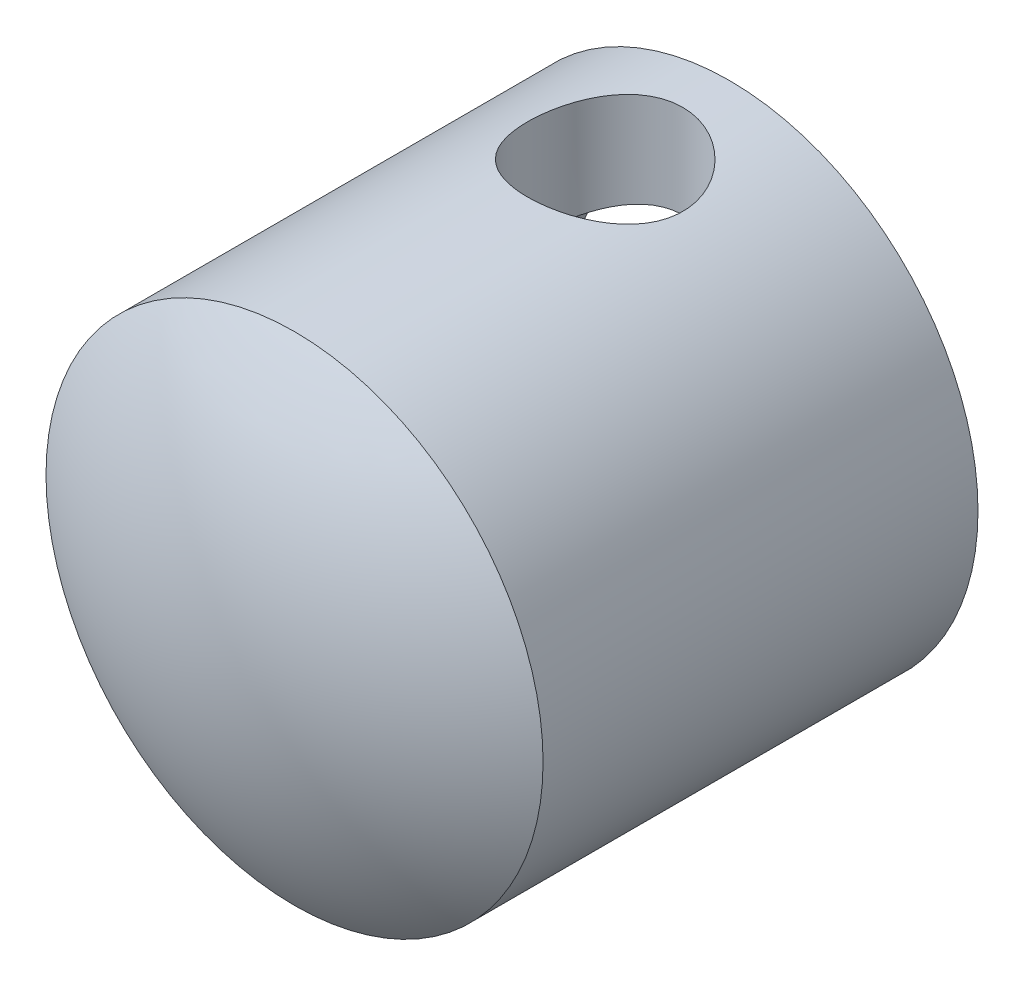
ISO-10303-21;
HEADER;
FILE_DESCRIPTION(('STEP AP214'),'2;1');
FILE_NAME('part.step','',(''),(''),'','','');
FILE_SCHEMA(('AUTOMOTIVE_DESIGN { 1 0 10303 214 1 1 1 1 }'));
ENDSEC;
DATA;
#1=APPLICATION_CONTEXT('core data for automotive mechanical design processes');
#2=APPLICATION_PROTOCOL_DEFINITION('international standard','automotive_design',2000,#1);
#3=PRODUCT_CONTEXT('',#1,'mechanical');
#4=PRODUCT('Part','Part','',(#3));
#5=PRODUCT_RELATED_PRODUCT_CATEGORY('part','',(#4));
#6=PRODUCT_DEFINITION_FORMATION('','',#4);
#7=PRODUCT_DEFINITION_CONTEXT('part definition',#1,'design');
#8=PRODUCT_DEFINITION('design','',#6,#7);
#9=PRODUCT_DEFINITION_SHAPE('','',#8);
#10=(LENGTH_UNIT() NAMED_UNIT(*) SI_UNIT(.MILLI.,.METRE.));
#11=(NAMED_UNIT(*) PLANE_ANGLE_UNIT() SI_UNIT($,.RADIAN.));
#12=(NAMED_UNIT(*) SI_UNIT($,.STERADIAN.) SOLID_ANGLE_UNIT());
#13=UNCERTAINTY_MEASURE_WITH_UNIT(LENGTH_MEASURE(1.E-05),#10,'distance_accuracy_value','');
#14=(GEOMETRIC_REPRESENTATION_CONTEXT(3) GLOBAL_UNCERTAINTY_ASSIGNED_CONTEXT((#13)) GLOBAL_UNIT_ASSIGNED_CONTEXT((#10,
#11,#12)) REPRESENTATION_CONTEXT('',''));
#15=CARTESIAN_POINT('',(0.,0.,0.));
#16=DIRECTION('',(0.,0.,1.));
#17=DIRECTION('',(1.,0.,0.));
#18=AXIS2_PLACEMENT_3D('',#15,#16,#17);
#19=CARTESIAN_POINT('',(0.,4.99999999999999,63.5));
#20=DIRECTION('',(0.,0.,-1.));
#21=DIRECTION('',(-1.,0.,0.));
#22=AXIS2_PLACEMENT_3D('',#19,#20,#21);
#23=PLANE('',#22);
#24=CARTESIAN_POINT('',(0.,0.,63.5));
#25=DIRECTION('',(0.,0.,-1.));
#26=DIRECTION('',(-1.,0.,0.));
#27=AXIS2_PLACEMENT_3D('',#24,#25,#26);
#28=CIRCLE('',#27,7.99999999999999);
#29=CARTESIAN_POINT('',(-7.99999999999999,0.,63.5));
#30=VERTEX_POINT('',#29);
#31=EDGE_CURVE('E11',#30,#30,#28,.T.);
#32=ORIENTED_EDGE('',*,*,#31,.T.);
#33=EDGE_LOOP('',(#32));
#34=FACE_BOUND('',#33,.T.);
#35=CARTESIAN_POINT('',(0.,0.,63.5));
#36=DIRECTION('',(0.,0.,-1.));
#37=DIRECTION('',(-1.,0.,0.));
#38=AXIS2_PLACEMENT_3D('',#35,#36,#37);
#39=CIRCLE('',#38,4.99999999999999);
#40=CARTESIAN_POINT('',(-4.99999999999999,0.,63.5));
#41=VERTEX_POINT('',#40);
#42=EDGE_CURVE('E72',#41,#41,#39,.T.);
#43=ORIENTED_EDGE('',*,*,#42,.F.);
#44=EDGE_LOOP('',(#43));
#45=FACE_BOUND('',#44,.T.);
#46=ADVANCED_FACE('F30',(#34,#45),#23,.T.);
#47=CARTESIAN_POINT('',(0.,0.,0.));
#48=DIRECTION('',(0.,0.,-1.));
#49=DIRECTION('',(-1.,0.,0.));
#50=AXIS2_PLACEMENT_3D('',#47,#48,#49);
#51=CYLINDRICAL_SURFACE('',#50,7.99999999999999);
#52=CARTESIAN_POINT('',(0.,-7.99999999999999,70.));
#53=CARTESIAN_POINT('',(-0.136878370349092,-7.99999931755979,69.9999991068248));
#54=CARTESIAN_POINT('',(-0.273766105005717,-7.99645389969681,69.9887215461111));
#55=CARTESIAN_POINT('',(-0.543538419176896,-7.98265788177612,69.9440275169215));
#56=CARTESIAN_POINT('',(-0.676422085451815,-7.97240576399718,69.9106060372713));
#57=CARTESIAN_POINT('',(-0.934257087301614,-7.94631631395818,69.8228612576086));
#58=CARTESIAN_POINT('',(-1.05922035397161,-7.93048762998049,69.7685703106941));
#59=CARTESIAN_POINT('',(-1.29826960469292,-7.89487938322184,69.6407653646433));
#60=CARTESIAN_POINT('',(-1.41235387088977,-7.87509919799809,69.5672483364388));
#61=CARTESIAN_POINT('',(-1.62993066990456,-7.83300427480564,69.4006880159653));
#62=CARTESIAN_POINT('',(-1.73304005631332,-7.81063431853977,69.3071582298779));
#63=CARTESIAN_POINT('',(-1.92239476407399,-7.76620092748416,69.1042632151729));
#64=CARTESIAN_POINT('',(-2.00863694579739,-7.74413755046914,68.9948950450109));
#65=CARTESIAN_POINT('',(-2.16388672966227,-7.70222289396344,68.7601108723838));
#66=CARTESIAN_POINT('',(-2.23241568300258,-7.6824397660359,68.6343650449456));
#67=CARTESIAN_POINT('',(-2.34719482153344,-7.64815603598468,68.3724153700363));
#68=CARTESIAN_POINT('',(-2.39345087543889,-7.63365404257376,68.2362142884121));
#69=CARTESIAN_POINT('',(-2.46096919860067,-7.61215213969001,67.9615438450959));
#70=CARTESIAN_POINT('',(-2.4829422001573,-7.60493945859016,67.8232663127223));
#71=CARTESIAN_POINT('',(-2.50349110073977,-7.598201102819,67.5448137621762));
#72=CARTESIAN_POINT('',(-2.50207321991544,-7.59867338454668,67.4046392583567));
#73=CARTESIAN_POINT('',(-2.47643649465479,-7.60706378150875,67.132251079462));
#74=CARTESIAN_POINT('',(-2.45312115738766,-7.61468683491896,66.9999417482769));
#75=CARTESIAN_POINT('',(-2.38581626711252,-7.63604051304977,66.7412156869253));
#76=CARTESIAN_POINT('',(-2.34182451689101,-7.64977178686229,66.6147995845824));
#77=CARTESIAN_POINT('',(-2.23377749362555,-7.68202088028592,66.3692961111347));
#78=CARTESIAN_POINT('',(-2.16943851324164,-7.70060569321648,66.250342778616));
#79=CARTESIAN_POINT('',(-2.02272041475696,-7.74043713160139,66.0246244642418));
#80=CARTESIAN_POINT('',(-1.94033661043155,-7.76168444789101,65.9178626594926));
#81=CARTESIAN_POINT('',(-1.75543390836425,-7.80563055600986,65.714450113166));
#82=CARTESIAN_POINT('',(-1.65216914118564,-7.8283513921139,65.6184808844406));
#83=CARTESIAN_POINT('',(-1.43072881619107,-7.8718314151916,65.4450562128407));
#84=CARTESIAN_POINT('',(-1.31255215469805,-7.89259045676744,65.3676021415616));
#85=CARTESIAN_POINT('',(-1.06332922093091,-7.93002589780382,65.2329446227974));
#86=CARTESIAN_POINT('',(-0.932189813838563,-7.94666921296415,65.1759037290721));
#87=CARTESIAN_POINT('',(-0.661535955565292,-7.97375911657107,65.0848939982969));
#88=CARTESIAN_POINT('',(-0.52202406144922,-7.98420758650304,65.0509181555232));
#89=CARTESIAN_POINT('',(-0.244370314580694,-7.99742778790026,65.008163914842));
#90=CARTESIAN_POINT('',(-0.10638369757769,-8.00048045790872,64.9984629128129));
#91=CARTESIAN_POINT('',(0.169260611465167,-7.99939599461966,65.0019324532746));
#92=CARTESIAN_POINT('',(0.306918348613013,-7.9952599116227,65.0150996546452));
#93=CARTESIAN_POINT('',(0.574438665951694,-7.98044727539522,65.0631911852128));
#94=CARTESIAN_POINT('',(0.704409956841871,-7.96993586221374,65.097566535225));
#95=CARTESIAN_POINT('',(0.956703857722752,-7.94360242758579,65.1864287047334));
#96=CARTESIAN_POINT('',(1.07902552089812,-7.92777975028687,65.24091800805));
#97=CARTESIAN_POINT('',(1.31586481334437,-7.89197085518847,65.3699464330974));
#98=CARTESIAN_POINT('',(1.43011947957558,-7.87189253635335,65.4449419749936));
#99=CARTESIAN_POINT('',(1.64473170192052,-7.82986820006858,65.6123064202348));
#100=CARTESIAN_POINT('',(1.7450854760879,-7.80792167695774,65.7046800354893));
#101=CARTESIAN_POINT('',(1.93317492583804,-7.76353989766282,65.9085177801042));
#102=CARTESIAN_POINT('',(2.02025304679063,-7.74111973412882,66.0205933274784));
#103=CARTESIAN_POINT('',(2.17442500490303,-7.69923894191211,66.2582532327535));
#104=CARTESIAN_POINT('',(2.24151915946859,-7.6797782662262,66.3838373760539));
#105=CARTESIAN_POINT('',(2.35340166961085,-7.64623564661737,66.6446903457409));
#106=CARTESIAN_POINT('',(2.39827639112025,-7.63213292713748,66.7799192988714));
#107=CARTESIAN_POINT('',(2.4644578863618,-7.6110234168862,67.0565449864972));
#108=CARTESIAN_POINT('',(2.48577362827989,-7.60401392602455,67.1979393526871));
#109=CARTESIAN_POINT('',(2.50358812316252,-7.59816585427752,67.4760081751608));
#110=CARTESIAN_POINT('',(2.50116559243272,-7.59897209200283,67.6126069076948));
#111=CARTESIAN_POINT('',(2.47417636257668,-7.60780180751806,67.8833491698839));
#112=CARTESIAN_POINT('',(2.44961069645025,-7.61582494863207,68.0174928137735));
#113=CARTESIAN_POINT('',(2.37975459827235,-7.63793628366779,68.2775880791838));
#114=CARTESIAN_POINT('',(2.33477284812017,-7.65193396380513,68.4036308821867));
#115=CARTESIAN_POINT('',(2.2256045467,-7.68439408509127,68.646480827068));
#116=CARTESIAN_POINT('',(2.16141408888474,-7.70285743429342,68.7632860841568));
#117=CARTESIAN_POINT('',(2.01271350026987,-7.74306974067005,68.9892919408796));
#118=CARTESIAN_POINT('',(1.92750667048265,-7.76491897845913,69.0980162590005));
#119=CARTESIAN_POINT('',(1.7404179928096,-7.80897997642419,69.299972656224));
#120=CARTESIAN_POINT('',(1.63853168468878,-7.83119183213308,69.3932005779821));
#121=CARTESIAN_POINT('',(1.4169733256467,-7.87434543904947,69.5645650767259));
#122=CARTESIAN_POINT('',(1.29682914897477,-7.89522203461345,69.6421094728999));
#123=CARTESIAN_POINT('',(1.04455827602731,-7.93253538593755,69.7757978302789));
#124=CARTESIAN_POINT('',(0.912436315590909,-7.94897388631643,69.8319502042837));
#125=CARTESIAN_POINT('',(0.651495270747968,-7.9744130146694,69.9171827352169));
#126=CARTESIAN_POINT('',(0.523340674225101,-7.98392481612282,69.9481497346107));
#127=CARTESIAN_POINT('',(0.263459790880499,-7.99671800680967,69.9895567199354));
#128=CARTESIAN_POINT('',(0.131734232279351,-8.00000065679285,70.000000859608));
#129=CARTESIAN_POINT('',(0.,-7.99999999999999,70.));
#130=B_SPLINE_CURVE_WITH_KNOTS('',3,(#52,#53,#54,#55,#56,#57,#58,#59,#60,#61,#62,#63,#64,#65,
#66,#67,#68,#69,#70,#71,#72,#73,#74,#75,#76,#77,#78,#79,#80,#81,#82,#83,#84,#85,#86,#87,#88,#89,
#90,#91,#92,#93,#94,#95,#96,#97,#98,#99,#100,#101,#102,#103,#104,#105,#106,#107,#108,#109,#110,
#111,#112,#113,#114,#115,#116,#117,#118,#119,#120,#121,#122,#123,#124,#125,#126,#127,#128,#129),
.UNSPECIFIED.,.T.,.F.,(4,2,2,2,2,2,2,2,2,2,2,2,2,2,2,2,2,2,2,2,2,2,2,2,2,2,2,2,2,2,2,2,2,2,2,2,
2,2,4),(0.,0.410150898865019,0.820394646698131,1.23000495840488,1.63967984311678,
2.06075644390316,2.48191134862553,2.91347542494989,3.34492572559054,3.76338300334422,
4.18172900590277,4.58353834844339,4.98539039958127,5.39311285441092,5.80094132020718,
6.22733494559201,6.65376014826607,7.08350921379542,7.51312768989109,7.92615137096476,
8.33911471298727,8.74181253445746,9.14456010069,9.55712649476688,9.9698049141852,
10.3988355742628,10.8278594196743,11.2552023150671,11.6823824779468,12.0902440696666,
12.4980866352127,12.8999582681244,13.3019116867945,13.7195902803182,14.1373807476578,
14.5688133627192,15.0000761335177,15.3948927332218,15.7896294154519),.UNSPECIFIED.);
#131=CARTESIAN_POINT('',(0.,-7.99999999999999,70.));
#132=VERTEX_POINT('',#131);
#133=EDGE_CURVE('E75',#132,#132,#130,.T.);
#134=ORIENTED_EDGE('',*,*,#133,.F.);
#135=EDGE_LOOP('',(#134));
#136=FACE_BOUND('',#135,.T.);
#137=CARTESIAN_POINT('',(0.,7.99999999999999,70.));
#138=CARTESIAN_POINT('',(0.136878370349093,7.99999931755979,69.9999991068248));
#139=CARTESIAN_POINT('',(0.273766105005718,7.99645389969681,69.9887215461111));
#140=CARTESIAN_POINT('',(0.543538419176896,7.98265788177612,69.9440275169215));
#141=CARTESIAN_POINT('',(0.676422085451816,7.97240576399718,69.9106060372713));
#142=CARTESIAN_POINT('',(0.934257087301615,7.94631631395818,69.8228612576086));
#143=CARTESIAN_POINT('',(1.05922035397161,7.93048762998049,69.7685703106941));
#144=CARTESIAN_POINT('',(1.29826960469292,7.89487938322184,69.6407653646433));
#145=CARTESIAN_POINT('',(1.41235387088977,7.87509919799809,69.5672483364388));
#146=CARTESIAN_POINT('',(1.62993066990456,7.83300427480564,69.4006880159653));
#147=CARTESIAN_POINT('',(1.73304005631332,7.81063431853977,69.3071582298779));
#148=CARTESIAN_POINT('',(1.92239476407399,7.76620092748416,69.1042632151729));
#149=CARTESIAN_POINT('',(2.00863694579739,7.74413755046914,68.9948950450109));
#150=CARTESIAN_POINT('',(2.16388672966227,7.70222289396344,68.7601108723838));
#151=CARTESIAN_POINT('',(2.23241568300258,7.6824397660359,68.6343650449456));
#152=CARTESIAN_POINT('',(2.34719482153344,7.64815603598468,68.3724153700363));
#153=CARTESIAN_POINT('',(2.3934508754389,7.63365404257376,68.2362142884121));
#154=CARTESIAN_POINT('',(2.46096919860067,7.61215213969001,67.9615438450959));
#155=CARTESIAN_POINT('',(2.4829422001573,7.60493945859016,67.8232663127223));
#156=CARTESIAN_POINT('',(2.50349110073977,7.598201102819,67.5448137621762));
#157=CARTESIAN_POINT('',(2.50207321991544,7.59867338454668,67.4046392583567));
#158=CARTESIAN_POINT('',(2.47643649465479,7.60706378150875,67.132251079462));
#159=CARTESIAN_POINT('',(2.45312115738766,7.61468683491896,66.9999417482769));
#160=CARTESIAN_POINT('',(2.38581626711252,7.63604051304977,66.7412156869253));
#161=CARTESIAN_POINT('',(2.34182451689101,7.64977178686229,66.6147995845824));
#162=CARTESIAN_POINT('',(2.23377749362555,7.68202088028592,66.3692961111347));
#163=CARTESIAN_POINT('',(2.16943851324164,7.70060569321648,66.250342778616));
#164=CARTESIAN_POINT('',(2.02272041475696,7.74043713160139,66.0246244642418));
#165=CARTESIAN_POINT('',(1.94033661043155,7.76168444789101,65.9178626594926));
#166=CARTESIAN_POINT('',(1.75543390836425,7.80563055600986,65.714450113166));
#167=CARTESIAN_POINT('',(1.65216914118564,7.8283513921139,65.6184808844406));
#168=CARTESIAN_POINT('',(1.43072881619107,7.8718314151916,65.4450562128407));
#169=CARTESIAN_POINT('',(1.31255215469805,7.89259045676744,65.3676021415616));
#170=CARTESIAN_POINT('',(1.06332922093091,7.93002589780382,65.2329446227974));
#171=CARTESIAN_POINT('',(0.932189813838564,7.94666921296415,65.1759037290721));
#172=CARTESIAN_POINT('',(0.661535955565292,7.97375911657107,65.0848939982969));
#173=CARTESIAN_POINT('',(0.522024061449221,7.98420758650304,65.0509181555232));
#174=CARTESIAN_POINT('',(0.244370314580695,7.99742778790026,65.008163914842));
#175=CARTESIAN_POINT('',(0.106383697577691,8.00048045790872,64.9984629128129));
#176=CARTESIAN_POINT('',(-0.169260611465166,7.99939599461966,65.0019324532746));
#177=CARTESIAN_POINT('',(-0.306918348613012,7.99525991162269,65.0150996546452));
#178=CARTESIAN_POINT('',(-0.574438665951693,7.98044727539522,65.0631911852128));
#179=CARTESIAN_POINT('',(-0.70440995684187,7.96993586221374,65.097566535225));
#180=CARTESIAN_POINT('',(-0.956703857722751,7.94360242758579,65.1864287047334));
#181=CARTESIAN_POINT('',(-1.07902552089811,7.92777975028687,65.24091800805));
#182=CARTESIAN_POINT('',(-1.31586481334437,7.89197085518847,65.3699464330974));
#183=CARTESIAN_POINT('',(-1.43011947957558,7.87189253635335,65.4449419749936));
#184=CARTESIAN_POINT('',(-1.64473170192052,7.82986820006859,65.6123064202348));
#185=CARTESIAN_POINT('',(-1.7450854760879,7.80792167695774,65.7046800354893));
#186=CARTESIAN_POINT('',(-1.93317492583804,7.76353989766282,65.9085177801042));
#187=CARTESIAN_POINT('',(-2.02025304679062,7.74111973412882,66.0205933274784));
#188=CARTESIAN_POINT('',(-2.17442500490303,7.69923894191211,66.2582532327535));
#189=CARTESIAN_POINT('',(-2.24151915946859,7.6797782662262,66.3838373760539));
#190=CARTESIAN_POINT('',(-2.35340166961085,7.64623564661737,66.6446903457409));
#191=CARTESIAN_POINT('',(-2.39827639112025,7.63213292713748,66.7799192988714));
#192=CARTESIAN_POINT('',(-2.4644578863618,7.6110234168862,67.0565449864972));
#193=CARTESIAN_POINT('',(-2.48577362827989,7.60401392602455,67.1979393526871));
#194=CARTESIAN_POINT('',(-2.50358812316252,7.59816585427752,67.4760081751609));
#195=CARTESIAN_POINT('',(-2.50116559243272,7.59897209200283,67.6126069076948));
#196=CARTESIAN_POINT('',(-2.47417636257668,7.60780180751806,67.8833491698839));
#197=CARTESIAN_POINT('',(-2.44961069645024,7.61582494863207,68.0174928137735));
#198=CARTESIAN_POINT('',(-2.37975459827235,7.63793628366779,68.2775880791838));
#199=CARTESIAN_POINT('',(-2.33477284812017,7.65193396380513,68.4036308821867));
#200=CARTESIAN_POINT('',(-2.2256045467,7.68439408509127,68.646480827068));
#201=CARTESIAN_POINT('',(-2.16141408888474,7.70285743429342,68.7632860841568));
#202=CARTESIAN_POINT('',(-2.01271350026988,7.74306974067004,68.9892919408796));
#203=CARTESIAN_POINT('',(-1.92750667048266,7.76491897845912,69.0980162590005));
#204=CARTESIAN_POINT('',(-1.74041799280961,7.80897997642419,69.299972656224));
#205=CARTESIAN_POINT('',(-1.63853168468879,7.83119183213308,69.3932005779821));
#206=CARTESIAN_POINT('',(-1.4169733256467,7.87434543904947,69.5645650767259));
#207=CARTESIAN_POINT('',(-1.29682914897477,7.89522203461345,69.6421094728999));
#208=CARTESIAN_POINT('',(-1.04455827602731,7.93253538593755,69.7757978302789));
#209=CARTESIAN_POINT('',(-0.912436315590908,7.94897388631643,69.8319502042837));
#210=CARTESIAN_POINT('',(-0.651495270747968,7.9744130146694,69.9171827352169));
#211=CARTESIAN_POINT('',(-0.5233406742251,7.98392481612282,69.9481497346107));
#212=CARTESIAN_POINT('',(-0.263459790880499,7.99671800680967,69.9895567199354));
#213=CARTESIAN_POINT('',(-0.131734232279351,8.00000065679285,70.000000859608));
#214=CARTESIAN_POINT('',(0.,7.99999999999999,70.));
#215=B_SPLINE_CURVE_WITH_KNOTS('',3,(#137,#138,#139,#140,#141,#142,#143,#144,#145,#146,#147,
#148,#149,#150,#151,#152,#153,#154,#155,#156,#157,#158,#159,#160,#161,#162,#163,#164,#165,#166,
#167,#168,#169,#170,#171,#172,#173,#174,#175,#176,#177,#178,#179,#180,#181,#182,#183,#184,#185,
#186,#187,#188,#189,#190,#191,#192,#193,#194,#195,#196,#197,#198,#199,#200,#201,#202,#203,#204,
#205,#206,#207,#208,#209,#210,#211,#212,#213,#214),.UNSPECIFIED.,.T.,.F.,(4,2,2,2,2,2,2,2,2,2,2,
2,2,2,2,2,2,2,2,2,2,2,2,2,2,2,2,2,2,2,2,2,2,2,2,2,2,2,4),(0.,0.410150898865019,
0.820394646698131,1.23000495840488,1.63967984311678,2.06075644390316,2.48191134862553,
2.91347542494989,3.34492572559054,3.76338300334422,4.18172900590277,4.58353834844339,
4.98539039958127,5.39311285441092,5.80094132020718,6.22733494559201,6.65376014826607,
7.08350921379542,7.51312768989109,7.92615137096476,8.33911471298727,8.74181253445746,
9.14456010069,9.55712649476687,9.96980491418519,10.3988355742628,10.8278594196743,
11.2552023150671,11.6823824779468,12.0902440696666,12.4980866352127,12.8999582681244,
13.3019116867944,13.7195902803182,14.1373807476578,14.5688133627192,15.0000761335177,
15.3948927332218,15.7896294154519),.UNSPECIFIED.);
#216=CARTESIAN_POINT('',(0.,7.99999999999999,70.));
#217=VERTEX_POINT('',#216);
#218=EDGE_CURVE('E81',#217,#217,#215,.T.);
#219=ORIENTED_EDGE('',*,*,#218,.F.);
#220=EDGE_LOOP('',(#219));
#221=FACE_BOUND('',#220,.T.);
#222=CARTESIAN_POINT('',(0.,0.,77.5));
#223=DIRECTION('',(0.,0.,-1.));
#224=DIRECTION('',(-1.,0.,0.));
#225=AXIS2_PLACEMENT_3D('',#222,#223,#224);
#226=CIRCLE('',#225,7.99999999999999);
#227=CARTESIAN_POINT('',(-7.99999999999999,0.,77.5));
#228=VERTEX_POINT('',#227);
#229=EDGE_CURVE('E41',#228,#228,#226,.T.);
#230=ORIENTED_EDGE('',*,*,#229,.T.);
#231=EDGE_LOOP('',(#230));
#232=FACE_BOUND('',#231,.T.);
#233=ORIENTED_EDGE('',*,*,#31,.F.);
#234=EDGE_LOOP('',(#233));
#235=FACE_BOUND('',#234,.T.);
#236=ADVANCED_FACE('F58',(#136,#221,#232,#235),#51,.T.);
#237=CARTESIAN_POINT('',(0.,0.,66.010874706924));
#238=DIRECTION('',(0.,0.,-1.));
#239=DIRECTION('',(0.,1.,0.));
#240=AXIS2_PLACEMENT_3D('',#237,#238,#239);
#241=SPHERICAL_SURFACE('',#240,14.);
#242=ORIENTED_EDGE('',*,*,#229,.F.);
#243=EDGE_LOOP('',(#242));
#244=FACE_BOUND('',#243,.T.);
#245=ADVANCED_FACE('F48',(#244),#241,.T.);
#246=CARTESIAN_POINT('',(0.,0.,77.4103988596214));
#247=DIRECTION('',(0.,0.,-1.));
#248=DIRECTION('',(-1.,0.,0.));
#249=AXIS2_PLACEMENT_3D('',#246,#247,#248);
#250=CONICAL_SURFACE('',#249,0.,0.941786206055793);
#251=CARTESIAN_POINT('',(0.,0.,74.5));
#252=DIRECTION('',(0.,0.,-1.));
#253=DIRECTION('',(-1.,0.,0.));
#254=AXIS2_PLACEMENT_3D('',#251,#252,#253);
#255=CIRCLE('',#254,4.00000000000001);
#256=CARTESIAN_POINT('',(-4.00000000000001,0.,74.5));
#257=VERTEX_POINT('',#256);
#258=EDGE_CURVE('E89',#257,#257,#255,.T.);
#259=ORIENTED_EDGE('',*,*,#258,.T.);
#260=EDGE_LOOP('',(#259));
#261=FACE_BOUND('',#260,.T.);
#262=CARTESIAN_POINT('',(0.,0.,77.4103988596214));
#263=VERTEX_POINT('',#262);
#264=VERTEX_LOOP('',#263);
#265=FACE_BOUND('',#264,.T.);
#266=ADVANCED_FACE('F45',(#261,#265),#250,.F.);
#267=CARTESIAN_POINT('',(0.,0.,0.));
#268=DIRECTION('',(0.,0.,-1.));
#269=DIRECTION('',(-1.,0.,0.));
#270=AXIS2_PLACEMENT_3D('',#267,#268,#269);
#271=CYLINDRICAL_SURFACE('',#270,4.00000000000001);
#272=CARTESIAN_POINT('',(0.,0.,73.5));
#273=DIRECTION('',(0.,0.,-1.));
#274=DIRECTION('',(-1.,0.,0.));
#275=AXIS2_PLACEMENT_3D('',#272,#273,#274);
#276=CIRCLE('',#275,4.00000000000001);
#277=CARTESIAN_POINT('',(-4.00000000000001,0.,73.5));
#278=VERTEX_POINT('',#277);
#279=EDGE_CURVE('E78',#278,#278,#276,.T.);
#280=ORIENTED_EDGE('',*,*,#279,.T.);
#281=EDGE_LOOP('',(#280));
#282=FACE_BOUND('',#281,.T.);
#283=ORIENTED_EDGE('',*,*,#258,.F.);
#284=EDGE_LOOP('',(#283));
#285=FACE_BOUND('',#284,.T.);
#286=ADVANCED_FACE('F47',(#282,#285),#271,.F.);
#287=CARTESIAN_POINT('',(0.,4.99999999999999,73.5));
#288=DIRECTION('',(0.,0.,-1.));
#289=DIRECTION('',(-1.,0.,0.));
#290=AXIS2_PLACEMENT_3D('',#287,#288,#289);
#291=PLANE('',#290);
#292=CARTESIAN_POINT('',(0.,0.,73.5));
#293=DIRECTION('',(0.,0.,-1.));
#294=DIRECTION('',(-1.,0.,0.));
#295=AXIS2_PLACEMENT_3D('',#292,#293,#294);
#296=CIRCLE('',#295,4.99999999999999);
#297=CARTESIAN_POINT('',(-4.99999999999999,0.,73.5));
#298=VERTEX_POINT('',#297);
#299=EDGE_CURVE('E74',#298,#298,#296,.T.);
#300=ORIENTED_EDGE('',*,*,#299,.T.);
#301=EDGE_LOOP('',(#300));
#302=FACE_BOUND('',#301,.T.);
#303=ORIENTED_EDGE('',*,*,#279,.F.);
#304=EDGE_LOOP('',(#303));
#305=FACE_BOUND('',#304,.T.);
#306=ADVANCED_FACE('F55',(#302,#305),#291,.T.);
#307=CARTESIAN_POINT('',(0.,0.,0.));
#308=DIRECTION('',(0.,0.,-1.));
#309=DIRECTION('',(-1.,0.,0.));
#310=AXIS2_PLACEMENT_3D('',#307,#308,#309);
#311=CYLINDRICAL_SURFACE('',#310,4.99999999999999);
#312=CARTESIAN_POINT('',(0.,-4.99999999999999,70.));
#313=CARTESIAN_POINT('',(0.131426682334305,-4.99999177550471,69.999990330944));
#314=CARTESIAN_POINT('',(0.263015634437212,-4.99476199135276,69.989574438226));
#315=CARTESIAN_POINT('',(0.522301454622883,-4.97435418561019,69.948368178838));
#316=CARTESIAN_POINT('',(0.649990448564106,-4.95915727187669,69.917539119075));
#317=CARTESIAN_POINT('',(0.897333631316202,-4.92040690922476,69.8370153772812));
#318=CARTESIAN_POINT('',(1.01701694536277,-4.89688595907258,69.7873940122173));
#319=CARTESIAN_POINT('',(1.2461816039967,-4.84364443325826,69.6710734737482));
#320=CARTESIAN_POINT('',(1.3556637520377,-4.8139243464442,69.6043756468549));
#321=CARTESIAN_POINT('',(1.56876952630998,-4.74890645050631,69.4512068683574));
#322=CARTESIAN_POINT('',(1.67163802294308,-4.7133799765909,69.3637837997702));
#323=CARTESIAN_POINT('',(1.86194861703332,-4.6414992577673,69.1736963040147));
#324=CARTESIAN_POINT('',(1.94937895911555,-4.60514440566897,69.0710203711599));
#325=CARTESIAN_POINT('',(2.11312999967247,-4.5324737794562,68.8437916255547));
#326=CARTESIAN_POINT('',(2.18806333849065,-4.49637967412566,68.718159753965));
#327=CARTESIAN_POINT('',(2.31542056761492,-4.43214946943554,68.4540816602046));
#328=CARTESIAN_POINT('',(2.36786053751683,-4.40400769020791,68.3156446782374));
#329=CARTESIAN_POINT('',(2.44533110537653,-4.36144667591401,68.0383372364036));
#330=CARTESIAN_POINT('',(2.47181464267579,-4.34630678958451,67.8999888698204));
#331=CARTESIAN_POINT('',(2.50106748329741,-4.32954724872149,67.6200529055624));
#332=CARTESIAN_POINT('',(2.50386022093907,-4.32791423358428,67.4784686478249));
#333=CARTESIAN_POINT('',(2.48671821792513,-4.33777325642935,67.2142849392091));
#334=CARTESIAN_POINT('',(2.46946139884055,-4.34771909154983,67.0914399219417));
#335=CARTESIAN_POINT('',(2.41734962264384,-4.37690571834674,66.8506952265681));
#336=CARTESIAN_POINT('',(2.38248905974454,-4.39614947079453,66.7327971367369));
#337=CARTESIAN_POINT('',(2.2955244509646,-4.44218691031837,66.5019271685857));
#338=CARTESIAN_POINT('',(2.24303766778988,-4.46914601659991,66.3891340030355));
#339=CARTESIAN_POINT('',(2.12260421917012,-4.52758510703512,66.173414268525));
#340=CARTESIAN_POINT('',(2.05465060953121,-4.55906711950476,66.0704921609998));
#341=CARTESIAN_POINT('',(1.89516513728194,-4.62782894758212,65.8636968681419));
#342=CARTESIAN_POINT('',(1.8017361459232,-4.66533775591864,65.7613578160596));
#343=CARTESIAN_POINT('',(1.59888894685345,-4.73869058251017,65.5731614535228));
#344=CARTESIAN_POINT('',(1.48946314143572,-4.77453379897002,65.4873120199153));
#345=CARTESIAN_POINT('',(1.25129126457963,-4.84254968207407,65.3307858474257));
#346=CARTESIAN_POINT('',(1.12188397899854,-4.87447460405014,65.2609988188857));
#347=CARTESIAN_POINT('',(0.851165538721995,-4.92894702803108,65.1447574273925));
#348=CARTESIAN_POINT('',(0.70986394066317,-4.95150197358892,65.0982845374621));
#349=CARTESIAN_POINT('',(0.431916229151786,-4.98310834353578,65.0338114907083));
#350=CARTESIAN_POINT('',(0.29585382637091,-4.99312345753239,65.013771910633));
#351=CARTESIAN_POINT('',(0.0219489998732916,-5.00182533647793,64.9963381721638));
#352=CARTESIAN_POINT('',(-0.115892549675106,-5.00051746803425,64.9989332859015));
#353=CARTESIAN_POINT('',(-0.378082429964655,-4.98727980633467,65.0255167210467));
#354=CARTESIAN_POINT('',(-0.502648520123706,-4.97618114219991,65.0478313318244));
#355=CARTESIAN_POINT('',(-0.746017230755972,-4.94555428287528,65.1105951797384));
#356=CARTESIAN_POINT('',(-0.864819214231883,-4.92602515837624,65.1510464161359));
#357=CARTESIAN_POINT('',(-1.09722152111965,-4.87960628532328,65.2499961660804));
#358=CARTESIAN_POINT('',(-1.21057599249831,-4.85252204417872,65.3089776252823));
#359=CARTESIAN_POINT('',(-1.42615340426439,-4.79359935799749,65.4427688391248));
#360=CARTESIAN_POINT('',(-1.52837157450203,-4.76175888940533,65.5175853365199));
#361=CARTESIAN_POINT('',(-1.72941922315487,-4.69270553315086,65.6894010632909));
#362=CARTESIAN_POINT('',(-1.82693019428496,-4.65527212009487,65.7878571709752));
#363=CARTESIAN_POINT('',(-2.0046408025722,-4.58155978921586,65.9998128780494));
#364=CARTESIAN_POINT('',(-2.08482846428685,-4.54528168472406,66.1133227970699));
#365=CARTESIAN_POINT('',(-2.22926978618995,-4.47627980545279,66.3591091354846));
#366=CARTESIAN_POINT('',(-2.29256373922244,-4.44381323981253,66.4920281652911));
#367=CARTESIAN_POINT('',(-2.39520706511459,-4.38935180726744,66.7687751688826));
#368=CARTESIAN_POINT('',(-2.43458729077056,-4.36734345549013,66.912588816));
#369=CARTESIAN_POINT('',(-2.48465421767006,-4.3390375256935,67.1922755573629));
#370=CARTESIAN_POINT('',(-2.49773248744361,-4.33143458674095,67.327585634119));
#371=CARTESIAN_POINT('',(-2.50172288950899,-4.32913386592578,67.5986176673807));
#372=CARTESIAN_POINT('',(-2.49264462983266,-4.33443049025109,67.7343394198736));
#373=CARTESIAN_POINT('',(-2.45481530197332,-4.35594655164662,67.9887087556169));
#374=CARTESIAN_POINT('',(-2.42802074302696,-4.37107736338132,68.1077511817208));
#375=CARTESIAN_POINT('',(-2.35793843840544,-4.40927540337601,68.3395202922));
#376=CARTESIAN_POINT('',(-2.31464538728733,-4.43234518434964,68.4522449315665));
#377=CARTESIAN_POINT('',(-2.20953919315538,-4.48571326433412,68.6765621527197));
#378=CARTESIAN_POINT('',(-2.14667719009404,-4.51639307998449,68.787569851735));
#379=CARTESIAN_POINT('',(-2.0053780838799,-4.58088327077454,68.9981862432401));
#380=CARTESIAN_POINT('',(-1.92693287765889,-4.61469526970765,69.0977889626287));
#381=CARTESIAN_POINT('',(-1.74550556946066,-4.6865581632701,69.2953553637496));
#382=CARTESIAN_POINT('',(-1.6407002246921,-4.72462491514979,69.3916493641714));
#383=CARTESIAN_POINT('',(-1.41539785420684,-4.79694347383544,69.565655849428));
#384=CARTESIAN_POINT('',(-1.29489242426333,-4.83119321905445,69.6433583186059));
#385=CARTESIAN_POINT('',(-1.03978808878537,-4.89245149457781,69.7780969794841));
#386=CARTESIAN_POINT('',(-0.905095560782291,-4.91940711437487,69.8349831677845));
#387=CARTESIAN_POINT('',(-0.696328709257353,-4.9517796092335,69.9021838587924));
#388=CARTESIAN_POINT('',(-0.625670413494091,-4.96122314081873,69.9215553980018));
#389=CARTESIAN_POINT('',(-0.482623997839262,-4.977171272751,69.9540659483706));
#390=CARTESIAN_POINT('',(-0.410236963092408,-4.98367766823158,69.9672087666764));
#391=CARTESIAN_POINT('',(-0.281518684621677,-4.99238200766129,69.9847374722846));
#392=CARTESIAN_POINT('',(-0.225408499555449,-4.99523288466453,69.9904549365313));
#393=CARTESIAN_POINT('',(-0.11287552845629,-4.99904367329658,69.9980883294657));
#394=CARTESIAN_POINT('',(-0.0564527338382185,-5.00000353273197,70.0000041532255));
#395=CARTESIAN_POINT('',(0.,-4.99999999999999,70.));
#396=B_SPLINE_CURVE_WITH_KNOTS('',3,(#312,#313,#314,#315,#316,#317,#318,#319,#320,#321,#322,
#323,#324,#325,#326,#327,#328,#329,#330,#331,#332,#333,#334,#335,#336,#337,#338,#339,#340,#341,
#342,#343,#344,#345,#346,#347,#348,#349,#350,#351,#352,#353,#354,#355,#356,#357,#358,#359,#360,
#361,#362,#363,#364,#365,#366,#367,#368,#369,#370,#371,#372,#373,#374,#375,#376,#377,#378,#379,
#380,#381,#382,#383,#384,#385,#386,#387,#388,#389,#390,#391,#392,#393,#394,#395),.UNSPECIFIED.,
.T.,.F.,(4,2,2,2,2,2,2,2,2,2,2,2,2,2,2,2,2,2,2,2,2,2,2,2,2,2,2,2,2,2,2,2,2,2,2,2,2,2,2,2,2,4),
(0.,0.394060643550731,0.788870374272993,1.18215538873074,1.57540940145392,1.99245439679522,
2.40981559413508,2.85954316076882,3.30894869745702,3.73145030350574,4.15353393322552,
4.52514281023302,4.89687009814195,5.27725600421219,5.65781303150554,6.08662353334696,
6.51563836496716,6.96457555536102,7.413155422807,7.82458226178365,8.23581411278691,
8.61517266265306,8.9945730407733,9.38482140069748,9.7752362687085,10.2039902661037,
10.6330397153795,11.0828670540368,11.53211279863,11.9382326875699,12.3441764966107,
12.7114482562151,13.0788382197025,13.4709114195009,13.8631890285845,14.303131068923,
14.7433095845249,15.1866003415819,15.407934939208,15.6291340766844,15.7983933645035,
15.9676573239323),.UNSPECIFIED.);
#397=CARTESIAN_POINT('',(0.,-4.99999999999999,70.));
#398=VERTEX_POINT('',#397);
#399=EDGE_CURVE('E33',#398,#398,#396,.T.);
#400=ORIENTED_EDGE('',*,*,#399,.F.);
#401=EDGE_LOOP('',(#400));
#402=FACE_BOUND('',#401,.T.);
#403=CARTESIAN_POINT('',(0.,4.99999999999999,70.));
#404=CARTESIAN_POINT('',(-0.131426682334304,4.99999177550471,69.999990330944));
#405=CARTESIAN_POINT('',(-0.263015634437212,4.99476199135276,69.989574438226));
#406=CARTESIAN_POINT('',(-0.522301454622882,4.97435418561019,69.948368178838));
#407=CARTESIAN_POINT('',(-0.649990448564105,4.95915727187669,69.917539119075));
#408=CARTESIAN_POINT('',(-0.897333631316202,4.92040690922476,69.8370153772812));
#409=CARTESIAN_POINT('',(-1.01701694536277,4.89688595907258,69.7873940122173));
#410=CARTESIAN_POINT('',(-1.2461816039967,4.84364443325826,69.6710734737482));
#411=CARTESIAN_POINT('',(-1.3556637520377,4.8139243464442,69.6043756468549));
#412=CARTESIAN_POINT('',(-1.56876952630997,4.74890645050631,69.4512068683574));
#413=CARTESIAN_POINT('',(-1.67163802294308,4.7133799765909,69.3637837997702));
#414=CARTESIAN_POINT('',(-1.86194861703332,4.6414992577673,69.1736963040147));
#415=CARTESIAN_POINT('',(-1.94937895911555,4.60514440566897,69.0710203711599));
#416=CARTESIAN_POINT('',(-2.11312999967247,4.5324737794562,68.8437916255547));
#417=CARTESIAN_POINT('',(-2.18806333849065,4.49637967412566,68.718159753965));
#418=CARTESIAN_POINT('',(-2.31542056761492,4.43214946943554,68.4540816602046));
#419=CARTESIAN_POINT('',(-2.36786053751683,4.40400769020791,68.3156446782374));
#420=CARTESIAN_POINT('',(-2.44533110537653,4.36144667591401,68.0383372364036));
#421=CARTESIAN_POINT('',(-2.47181464267578,4.34630678958451,67.8999888698204));
#422=CARTESIAN_POINT('',(-2.50106748329741,4.32954724872149,67.6200529055624));
#423=CARTESIAN_POINT('',(-2.50386022093907,4.32791423358429,67.4784686478249));
#424=CARTESIAN_POINT('',(-2.48671821792513,4.33777325642935,67.2142849392091));
#425=CARTESIAN_POINT('',(-2.46946139884055,4.34771909154983,67.0914399219417));
#426=CARTESIAN_POINT('',(-2.41734962264384,4.37690571834674,66.8506952265681));
#427=CARTESIAN_POINT('',(-2.38248905974454,4.39614947079453,66.7327971367369));
#428=CARTESIAN_POINT('',(-2.2955244509646,4.44218691031837,66.5019271685857));
#429=CARTESIAN_POINT('',(-2.24303766778988,4.46914601659991,66.3891340030355));
#430=CARTESIAN_POINT('',(-2.12260421917012,4.52758510703512,66.173414268525));
#431=CARTESIAN_POINT('',(-2.05465060953121,4.55906711950476,66.0704921609998));
#432=CARTESIAN_POINT('',(-1.89516513728194,4.62782894758212,65.8636968681419));
#433=CARTESIAN_POINT('',(-1.8017361459232,4.66533775591864,65.7613578160596));
#434=CARTESIAN_POINT('',(-1.59888894685345,4.73869058251017,65.5731614535228));
#435=CARTESIAN_POINT('',(-1.48946314143572,4.77453379897002,65.4873120199153));
#436=CARTESIAN_POINT('',(-1.25129126457963,4.84254968207408,65.3307858474257));
#437=CARTESIAN_POINT('',(-1.12188397899853,4.87447460405014,65.2609988188857));
#438=CARTESIAN_POINT('',(-0.851165538721987,4.92894702803108,65.1447574273925));
#439=CARTESIAN_POINT('',(-0.709863940663166,4.95150197358892,65.0982845374621));
#440=CARTESIAN_POINT('',(-0.431916229151785,4.98310834353578,65.0338114907083));
#441=CARTESIAN_POINT('',(-0.295853826370909,4.99312345753239,65.013771910633));
#442=CARTESIAN_POINT('',(-0.0219489998732905,5.00182533647793,64.9963381721638));
#443=CARTESIAN_POINT('',(0.115892549675107,5.00051746803425,64.9989332859015));
#444=CARTESIAN_POINT('',(0.378082429964656,4.98727980633467,65.0255167210467));
#445=CARTESIAN_POINT('',(0.502648520123707,4.97618114219991,65.0478313318244));
#446=CARTESIAN_POINT('',(0.746017230755973,4.94555428287528,65.1105951797384));
#447=CARTESIAN_POINT('',(0.864819214231884,4.92602515837624,65.1510464161359));
#448=CARTESIAN_POINT('',(1.09722152111965,4.87960628532328,65.2499961660804));
#449=CARTESIAN_POINT('',(1.21057599249831,4.85252204417872,65.3089776252823));
#450=CARTESIAN_POINT('',(1.42615340426439,4.79359935799749,65.4427688391248));
#451=CARTESIAN_POINT('',(1.52837157450203,4.76175888940533,65.5175853365199));
#452=CARTESIAN_POINT('',(1.72941922315487,4.69270553315086,65.6894010632909));
#453=CARTESIAN_POINT('',(1.82693019428496,4.65527212009487,65.7878571709752));
#454=CARTESIAN_POINT('',(2.0046408025722,4.58155978921586,65.9998128780494));
#455=CARTESIAN_POINT('',(2.08482846428686,4.54528168472406,66.1133227970699));
#456=CARTESIAN_POINT('',(2.22926978618995,4.47627980545279,66.3591091354846));
#457=CARTESIAN_POINT('',(2.29256373922244,4.44381323981253,66.4920281652911));
#458=CARTESIAN_POINT('',(2.39520706511459,4.38935180726744,66.7687751688826));
#459=CARTESIAN_POINT('',(2.43458729077056,4.36734345549013,66.912588816));
#460=CARTESIAN_POINT('',(2.48465421767006,4.3390375256935,67.1922755573629));
#461=CARTESIAN_POINT('',(2.49773248744361,4.33143458674095,67.327585634119));
#462=CARTESIAN_POINT('',(2.50172288950899,4.32913386592578,67.5986176673807));
#463=CARTESIAN_POINT('',(2.49264462983266,4.33443049025109,67.7343394198736));
#464=CARTESIAN_POINT('',(2.45481530197332,4.35594655164662,67.9887087556169));
#465=CARTESIAN_POINT('',(2.42802074302696,4.37107736338132,68.1077511817208));
#466=CARTESIAN_POINT('',(2.35793843840544,4.40927540337601,68.3395202922));
#467=CARTESIAN_POINT('',(2.31464538728733,4.43234518434964,68.4522449315665));
#468=CARTESIAN_POINT('',(2.20953919315538,4.48571326433411,68.6765621527197));
#469=CARTESIAN_POINT('',(2.14667719009404,4.51639307998449,68.787569851735));
#470=CARTESIAN_POINT('',(2.0053780838799,4.58088327077454,68.9981862432401));
#471=CARTESIAN_POINT('',(1.92693287765889,4.61469526970765,69.0977889626287));
#472=CARTESIAN_POINT('',(1.74550556946066,4.6865581632701,69.2953553637496));
#473=CARTESIAN_POINT('',(1.6407002246921,4.72462491514979,69.3916493641714));
#474=CARTESIAN_POINT('',(1.41539785420684,4.79694347383544,69.565655849428));
#475=CARTESIAN_POINT('',(1.29489242426333,4.83119321905445,69.6433583186059));
#476=CARTESIAN_POINT('',(1.03978808878537,4.89245149457781,69.7780969794841));
#477=CARTESIAN_POINT('',(0.905095560782292,4.91940711437487,69.8349831677845));
#478=CARTESIAN_POINT('',(0.696328709257354,4.9517796092335,69.9021838587924));
#479=CARTESIAN_POINT('',(0.625670413494091,4.96122314081873,69.9215553980018));
#480=CARTESIAN_POINT('',(0.482623997839262,4.977171272751,69.9540659483706));
#481=CARTESIAN_POINT('',(0.410236963092409,4.98367766823158,69.9672087666764));
#482=CARTESIAN_POINT('',(0.281518684621678,4.99238200766129,69.9847374722846));
#483=CARTESIAN_POINT('',(0.22540849955545,4.99523288466453,69.9904549365313));
#484=CARTESIAN_POINT('',(0.112875528456291,4.99904367329658,69.9980883294657));
#485=CARTESIAN_POINT('',(0.0564527338382192,5.00000353273197,70.0000041532255));
#486=CARTESIAN_POINT('',(0.,4.99999999999999,70.));
#487=B_SPLINE_CURVE_WITH_KNOTS('',3,(#403,#404,#405,#406,#407,#408,#409,#410,#411,#412,#413,
#414,#415,#416,#417,#418,#419,#420,#421,#422,#423,#424,#425,#426,#427,#428,#429,#430,#431,#432,
#433,#434,#435,#436,#437,#438,#439,#440,#441,#442,#443,#444,#445,#446,#447,#448,#449,#450,#451,
#452,#453,#454,#455,#456,#457,#458,#459,#460,#461,#462,#463,#464,#465,#466,#467,#468,#469,#470,
#471,#472,#473,#474,#475,#476,#477,#478,#479,#480,#481,#482,#483,#484,#485,#486),.UNSPECIFIED.,
.T.,.F.,(4,2,2,2,2,2,2,2,2,2,2,2,2,2,2,2,2,2,2,2,2,2,2,2,2,2,2,2,2,2,2,2,2,2,2,2,2,2,2,2,2,4),
(0.,0.394060643550731,0.788870374272993,1.18215538873074,1.57540940145392,1.99245439679521,
2.40981559413508,2.85954316076882,3.30894869745702,3.73145030350574,4.15353393322552,
4.52514281023302,4.89687009814195,5.27725600421219,5.65781303150554,6.08662353334696,
6.51563836496715,6.96457555536102,7.41315542280699,7.82458226178365,8.23581411278691,
8.61517266265306,8.9945730407733,9.38482140069747,9.7752362687085,10.2039902661037,
10.6330397153795,11.0828670540368,11.53211279863,11.9382326875699,12.3441764966107,
12.7114482562151,13.0788382197025,13.4709114195009,13.8631890285845,14.303131068923,
14.7433095845248,15.1866003415819,15.407934939208,15.6291340766844,15.7983933645035,
15.9676573239323),.UNSPECIFIED.);
#488=CARTESIAN_POINT('',(0.,4.99999999999999,70.));
#489=VERTEX_POINT('',#488);
#490=EDGE_CURVE('E92',#489,#489,#487,.T.);
#491=ORIENTED_EDGE('',*,*,#490,.F.);
#492=EDGE_LOOP('',(#491));
#493=FACE_BOUND('',#492,.T.);
#494=ORIENTED_EDGE('',*,*,#42,.T.);
#495=EDGE_LOOP('',(#494));
#496=FACE_BOUND('',#495,.T.);
#497=ORIENTED_EDGE('',*,*,#299,.F.);
#498=EDGE_LOOP('',(#497));
#499=FACE_BOUND('',#498,.T.);
#500=ADVANCED_FACE('F96',(#402,#493,#496,#499),#311,.F.);
#501=CARTESIAN_POINT('',(0.,-10.,67.5));
#502=DIRECTION('',(0.,1.,0.));
#503=DIRECTION('',(0.,0.,1.));
#504=AXIS2_PLACEMENT_3D('',#501,#502,#503);
#505=CYLINDRICAL_SURFACE('',#504,2.5);
#506=ORIENTED_EDGE('',*,*,#218,.T.);
#507=EDGE_LOOP('',(#506));
#508=FACE_BOUND('',#507,.T.);
#509=ORIENTED_EDGE('',*,*,#490,.T.);
#510=EDGE_LOOP('',(#509));
#511=FACE_BOUND('',#510,.T.);
#512=ADVANCED_FACE('F99',(#508,#511),#505,.F.);
#513=ORIENTED_EDGE('',*,*,#133,.T.);
#514=EDGE_LOOP('',(#513));
#515=FACE_BOUND('',#514,.T.);
#516=ORIENTED_EDGE('',*,*,#399,.T.);
#517=EDGE_LOOP('',(#516));
#518=FACE_BOUND('',#517,.T.);
#519=ADVANCED_FACE('F102',(#515,#518),#505,.F.);
#520=CLOSED_SHELL('',(#46,#236,#245,#266,#286,#306,#500,#512,#519));
#521=MANIFOLD_SOLID_BREP('B2',#520);
#522=ADVANCED_BREP_SHAPE_REPRESENTATION('',(#18,#521),#14);
#523=SHAPE_DEFINITION_REPRESENTATION(#9,#522);
ENDSEC;
END-ISO-10303-21;
